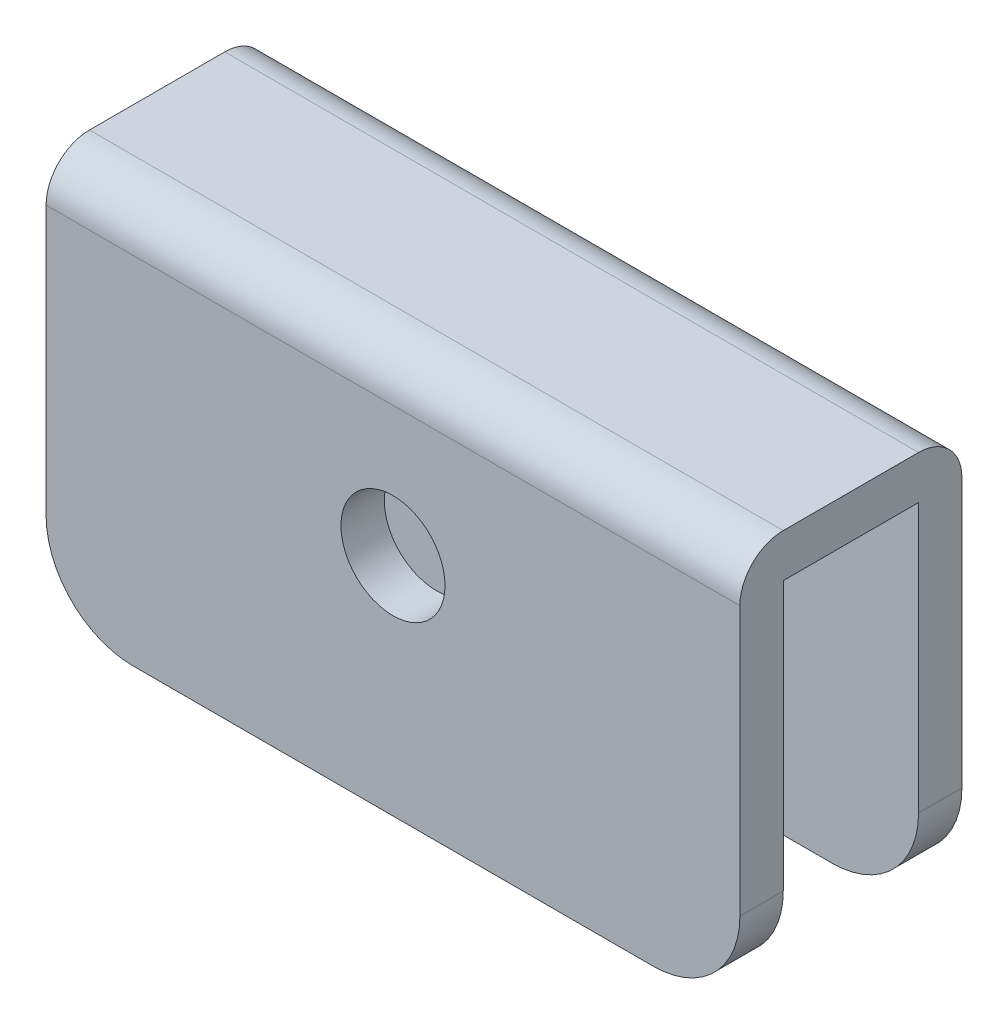
ISO-10303-21;
HEADER;
FILE_DESCRIPTION(('STEP AP214'),'2;1');
FILE_NAME('part.step','',(''),(''),'','','');
FILE_SCHEMA(('AUTOMOTIVE_DESIGN { 1 0 10303 214 1 1 1 1 }'));
ENDSEC;
DATA;
#1=APPLICATION_CONTEXT('core data for automotive mechanical design processes');
#2=APPLICATION_PROTOCOL_DEFINITION('international standard','automotive_design',2000,#1);
#3=PRODUCT_CONTEXT('',#1,'mechanical');
#4=PRODUCT('Part','Part','',(#3));
#5=PRODUCT_RELATED_PRODUCT_CATEGORY('part','',(#4));
#6=PRODUCT_DEFINITION_FORMATION('','',#4);
#7=PRODUCT_DEFINITION_CONTEXT('part definition',#1,'design');
#8=PRODUCT_DEFINITION('design','',#6,#7);
#9=PRODUCT_DEFINITION_SHAPE('','',#8);
#10=(LENGTH_UNIT() NAMED_UNIT(*) SI_UNIT(.MILLI.,.METRE.));
#11=(NAMED_UNIT(*) PLANE_ANGLE_UNIT() SI_UNIT($,.RADIAN.));
#12=(NAMED_UNIT(*) SI_UNIT($,.STERADIAN.) SOLID_ANGLE_UNIT());
#13=UNCERTAINTY_MEASURE_WITH_UNIT(LENGTH_MEASURE(1.E-05),#10,'distance_accuracy_value','');
#14=(GEOMETRIC_REPRESENTATION_CONTEXT(3) GLOBAL_UNCERTAINTY_ASSIGNED_CONTEXT((#13)) GLOBAL_UNIT_ASSIGNED_CONTEXT((#10,
#11,#12)) REPRESENTATION_CONTEXT('',''));
#15=CARTESIAN_POINT('',(0.,0.,0.));
#16=DIRECTION('',(0.,0.,1.));
#17=DIRECTION('',(1.,0.,0.));
#18=AXIS2_PLACEMENT_3D('',#15,#16,#17);
#19=CARTESIAN_POINT('',(-20.,-11.5,-6.4));
#20=DIRECTION('',(0.,-1.,0.));
#21=DIRECTION('',(0.,0.,-1.));
#22=AXIS2_PLACEMENT_3D('',#19,#20,#21);
#23=PLANE('',#22);
#24=DIRECTION('',(1.,0.,0.));
#25=VECTOR('',#24,1.);
#26=CARTESIAN_POINT('',(-41.9337639268777,-11.5,-3.9));
#27=LINE('',#26,#25);
#28=CARTESIAN_POINT('',(-15.,-11.5,-3.9));
#29=VERTEX_POINT('',#28);
#30=CARTESIAN_POINT('',(15.,-11.5,-3.9));
#31=VERTEX_POINT('',#30);
#32=EDGE_CURVE('E155',#29,#31,#27,.T.);
#33=ORIENTED_EDGE('',*,*,#32,.F.);
#34=DIRECTION('',(0.,0.,1.));
#35=VECTOR('',#34,1.);
#36=CARTESIAN_POINT('',(-15.,-11.5,-6.4));
#37=LINE('',#36,#35);
#38=CARTESIAN_POINT('',(-15.,-11.5,-6.4));
#39=VERTEX_POINT('',#38);
#40=EDGE_CURVE('E219',#29,#39,#37,.F.);
#41=ORIENTED_EDGE('',*,*,#40,.T.);
#42=DIRECTION('',(1.,0.,0.));
#43=VECTOR('',#42,1.);
#44=CARTESIAN_POINT('',(-20.,-11.5,-6.4));
#45=LINE('',#44,#43);
#46=CARTESIAN_POINT('',(15.,-11.5,-6.4));
#47=VERTEX_POINT('',#46);
#48=EDGE_CURVE('E199',#39,#47,#45,.T.);
#49=ORIENTED_EDGE('',*,*,#48,.T.);
#50=DIRECTION('',(0.,0.,1.));
#51=VECTOR('',#50,1.);
#52=CARTESIAN_POINT('',(15.,-11.5,-6.4));
#53=LINE('',#52,#51);
#54=EDGE_CURVE('E216',#47,#31,#53,.T.);
#55=ORIENTED_EDGE('',*,*,#54,.T.);
#56=EDGE_LOOP('',(#33,#41,#49,#55));
#57=FACE_BOUND('',#56,.T.);
#58=ADVANCED_FACE('F40',(#57),#23,.T.);
#59=CARTESIAN_POINT('',(20.,11.5,-6.4));
#60=DIRECTION('',(1.,0.,0.));
#61=DIRECTION('',(0.,1.,0.));
#62=AXIS2_PLACEMENT_3D('',#59,#60,#61);
#63=PLANE('',#62);
#64=DIRECTION('',(0.,1.,0.));
#65=VECTOR('',#64,1.);
#66=CARTESIAN_POINT('',(20.,11.5,-6.4));
#67=LINE('',#66,#65);
#68=CARTESIAN_POINT('',(20.,-6.5,-6.4));
#69=VERTEX_POINT('',#68);
#70=CARTESIAN_POINT('',(20.,9.,-6.4));
#71=VERTEX_POINT('',#70);
#72=EDGE_CURVE('E195',#69,#71,#67,.T.);
#73=ORIENTED_EDGE('',*,*,#72,.T.);
#74=CARTESIAN_POINT('',(20.,9.,-3.9));
#75=DIRECTION('',(1.,0.,0.));
#76=DIRECTION('',(0.,1.,0.));
#77=AXIS2_PLACEMENT_3D('',#74,#75,#76);
#78=CIRCLE('',#77,2.5);
#79=CARTESIAN_POINT('',(20.,11.5,-3.9));
#80=VERTEX_POINT('',#79);
#81=EDGE_CURVE('E49',#71,#80,#78,.T.);
#82=ORIENTED_EDGE('',*,*,#81,.T.);
#83=DIRECTION('',(0.,0.,1.));
#84=VECTOR('',#83,1.);
#85=CARTESIAN_POINT('',(20.,11.5,-6.4));
#86=LINE('',#85,#84);
#87=CARTESIAN_POINT('',(20.,11.5,3.9));
#88=VERTEX_POINT('',#87);
#89=EDGE_CURVE('E202',#80,#88,#86,.T.);
#90=ORIENTED_EDGE('',*,*,#89,.T.);
#91=CARTESIAN_POINT('',(20.,9.,3.9));
#92=DIRECTION('',(1.,0.,0.));
#93=DIRECTION('',(0.,1.,0.));
#94=AXIS2_PLACEMENT_3D('',#91,#92,#93);
#95=CIRCLE('',#94,2.5);
#96=CARTESIAN_POINT('',(20.,9.,6.4));
#97=VERTEX_POINT('',#96);
#98=EDGE_CURVE('E56',#88,#97,#95,.T.);
#99=ORIENTED_EDGE('',*,*,#98,.T.);
#100=DIRECTION('',(0.,1.,0.));
#101=VECTOR('',#100,1.);
#102=CARTESIAN_POINT('',(20.,11.5,6.4));
#103=LINE('',#102,#101);
#104=CARTESIAN_POINT('',(20.,-6.5,6.4));
#105=VERTEX_POINT('',#104);
#106=EDGE_CURVE('E188',#105,#97,#103,.T.);
#107=ORIENTED_EDGE('',*,*,#106,.F.);
#108=DIRECTION('',(0.,0.,1.));
#109=VECTOR('',#108,1.);
#110=CARTESIAN_POINT('',(20.,-6.5,-6.4));
#111=LINE('',#110,#109);
#112=CARTESIAN_POINT('',(20.,-6.5,3.9));
#113=VERTEX_POINT('',#112);
#114=EDGE_CURVE('E239',#105,#113,#111,.F.);
#115=ORIENTED_EDGE('',*,*,#114,.T.);
#116=DIRECTION('',(0.,-1.,0.));
#117=VECTOR('',#116,1.);
#118=CARTESIAN_POINT('',(20.,-11.5,3.9));
#119=LINE('',#118,#117);
#120=CARTESIAN_POINT('',(20.,9.,3.9));
#121=VERTEX_POINT('',#120);
#122=EDGE_CURVE('E156',#121,#113,#119,.T.);
#123=ORIENTED_EDGE('',*,*,#122,.F.);
#124=DIRECTION('',(0.,0.,1.));
#125=VECTOR('',#124,1.);
#126=CARTESIAN_POINT('',(20.,9.,3.9));
#127=LINE('',#126,#125);
#128=CARTESIAN_POINT('',(20.,9.,-3.9));
#129=VERTEX_POINT('',#128);
#130=EDGE_CURVE('E163',#129,#121,#127,.T.);
#131=ORIENTED_EDGE('',*,*,#130,.F.);
#132=DIRECTION('',(0.,1.,0.));
#133=VECTOR('',#132,1.);
#134=CARTESIAN_POINT('',(20.,-11.5,-3.9));
#135=LINE('',#134,#133);
#136=CARTESIAN_POINT('',(20.,-6.5,-3.9));
#137=VERTEX_POINT('',#136);
#138=EDGE_CURVE('E146',#137,#129,#135,.T.);
#139=ORIENTED_EDGE('',*,*,#138,.F.);
#140=DIRECTION('',(0.,0.,1.));
#141=VECTOR('',#140,1.);
#142=CARTESIAN_POINT('',(20.,-6.5,-6.4));
#143=LINE('',#142,#141);
#144=EDGE_CURVE('E241',#137,#69,#143,.F.);
#145=ORIENTED_EDGE('',*,*,#144,.T.);
#146=EDGE_LOOP('',(#73,#82,#90,#99,#107,#115,#123,#131,#139,#145));
#147=FACE_BOUND('',#146,.T.);
#148=ADVANCED_FACE('F169',(#147),#63,.T.);
#149=DIRECTION('',(1.,0.,0.));
#150=VECTOR('',#149,1.);
#151=CARTESIAN_POINT('',(-20.,-11.5,6.4));
#152=LINE('',#151,#150);
#153=CARTESIAN_POINT('',(-15.,-11.5,6.4));
#154=VERTEX_POINT('',#153);
#155=CARTESIAN_POINT('',(15.,-11.5,6.4));
#156=VERTEX_POINT('',#155);
#157=EDGE_CURVE('E192',#154,#156,#152,.T.);
#158=ORIENTED_EDGE('',*,*,#157,.F.);
#159=DIRECTION('',(0.,0.,1.));
#160=VECTOR('',#159,1.);
#161=CARTESIAN_POINT('',(-15.,-11.5,-6.4));
#162=LINE('',#161,#160);
#163=CARTESIAN_POINT('',(-15.,-11.5,3.9));
#164=VERTEX_POINT('',#163);
#165=EDGE_CURVE('E233',#154,#164,#162,.F.);
#166=ORIENTED_EDGE('',*,*,#165,.T.);
#167=DIRECTION('',(1.,0.,0.));
#168=VECTOR('',#167,1.);
#169=CARTESIAN_POINT('',(-41.9337639268777,-11.5,3.9));
#170=LINE('',#169,#168);
#171=CARTESIAN_POINT('',(15.,-11.5,3.9));
#172=VERTEX_POINT('',#171);
#173=EDGE_CURVE('E180',#164,#172,#170,.T.);
#174=ORIENTED_EDGE('',*,*,#173,.T.);
#175=DIRECTION('',(0.,0.,1.));
#176=VECTOR('',#175,1.);
#177=CARTESIAN_POINT('',(15.,-11.5,-6.4));
#178=LINE('',#177,#176);
#179=EDGE_CURVE('E230',#172,#156,#178,.T.);
#180=ORIENTED_EDGE('',*,*,#179,.T.);
#181=EDGE_LOOP('',(#158,#166,#174,#180));
#182=FACE_BOUND('',#181,.T.);
#183=ADVANCED_FACE('F292',(#182),#23,.T.);
#184=CARTESIAN_POINT('',(-20.,11.5,-6.4));
#185=DIRECTION('',(-1.,0.,0.));
#186=DIRECTION('',(0.,-1.,0.));
#187=AXIS2_PLACEMENT_3D('',#184,#185,#186);
#188=PLANE('',#187);
#189=DIRECTION('',(0.,0.,1.));
#190=VECTOR('',#189,1.);
#191=CARTESIAN_POINT('',(-20.,11.5,-6.4));
#192=LINE('',#191,#190);
#193=CARTESIAN_POINT('',(-20.,11.5,-3.9));
#194=VERTEX_POINT('',#193);
#195=CARTESIAN_POINT('',(-20.,11.5,3.9));
#196=VERTEX_POINT('',#195);
#197=EDGE_CURVE('E203',#194,#196,#192,.T.);
#198=ORIENTED_EDGE('',*,*,#197,.F.);
#199=CARTESIAN_POINT('',(-20.,9.,-3.9));
#200=DIRECTION('',(-1.,0.,0.));
#201=DIRECTION('',(0.,-1.,0.));
#202=AXIS2_PLACEMENT_3D('',#199,#200,#201);
#203=CIRCLE('',#202,2.5);
#204=CARTESIAN_POINT('',(-20.,9.,-6.4));
#205=VERTEX_POINT('',#204);
#206=EDGE_CURVE('E250',#194,#205,#203,.T.);
#207=ORIENTED_EDGE('',*,*,#206,.T.);
#208=DIRECTION('',(0.,-1.,0.));
#209=VECTOR('',#208,1.);
#210=CARTESIAN_POINT('',(-20.,11.5,-6.4));
#211=LINE('',#210,#209);
#212=CARTESIAN_POINT('',(-20.,-6.5,-6.4));
#213=VERTEX_POINT('',#212);
#214=EDGE_CURVE('E197',#205,#213,#211,.T.);
#215=ORIENTED_EDGE('',*,*,#214,.T.);
#216=DIRECTION('',(0.,0.,1.));
#217=VECTOR('',#216,1.);
#218=CARTESIAN_POINT('',(-20.,-6.5,-6.4));
#219=LINE('',#218,#217);
#220=CARTESIAN_POINT('',(-20.,-6.5,-3.9));
#221=VERTEX_POINT('',#220);
#222=EDGE_CURVE('E210',#213,#221,#219,.T.);
#223=ORIENTED_EDGE('',*,*,#222,.T.);
#224=DIRECTION('',(0.,1.,0.));
#225=VECTOR('',#224,1.);
#226=CARTESIAN_POINT('',(-20.,-11.5,-3.9));
#227=LINE('',#226,#225);
#228=CARTESIAN_POINT('',(-20.,9.,-3.9));
#229=VERTEX_POINT('',#228);
#230=EDGE_CURVE('E167',#221,#229,#227,.T.);
#231=ORIENTED_EDGE('',*,*,#230,.T.);
#232=DIRECTION('',(0.,0.,1.));
#233=VECTOR('',#232,1.);
#234=CARTESIAN_POINT('',(-20.,9.,3.9));
#235=LINE('',#234,#233);
#236=CARTESIAN_POINT('',(-20.,9.,3.9));
#237=VERTEX_POINT('',#236);
#238=EDGE_CURVE('E166',#229,#237,#235,.T.);
#239=ORIENTED_EDGE('',*,*,#238,.T.);
#240=DIRECTION('',(0.,-1.,0.));
#241=VECTOR('',#240,1.);
#242=CARTESIAN_POINT('',(-20.,-11.5,3.9));
#243=LINE('',#242,#241);
#244=CARTESIAN_POINT('',(-20.,-6.5,3.9));
#245=VERTEX_POINT('',#244);
#246=EDGE_CURVE('E177',#237,#245,#243,.T.);
#247=ORIENTED_EDGE('',*,*,#246,.T.);
#248=DIRECTION('',(0.,0.,1.));
#249=VECTOR('',#248,1.);
#250=CARTESIAN_POINT('',(-20.,-6.5,-6.4));
#251=LINE('',#250,#249);
#252=CARTESIAN_POINT('',(-20.,-6.5,6.4));
#253=VERTEX_POINT('',#252);
#254=EDGE_CURVE('E206',#245,#253,#251,.T.);
#255=ORIENTED_EDGE('',*,*,#254,.T.);
#256=DIRECTION('',(0.,-1.,0.));
#257=VECTOR('',#256,1.);
#258=CARTESIAN_POINT('',(-20.,11.5,6.4));
#259=LINE('',#258,#257);
#260=CARTESIAN_POINT('',(-20.,9.,6.4));
#261=VERTEX_POINT('',#260);
#262=EDGE_CURVE('E190',#261,#253,#259,.T.);
#263=ORIENTED_EDGE('',*,*,#262,.F.);
#264=CARTESIAN_POINT('',(-20.,9.,3.9));
#265=DIRECTION('',(-1.,0.,0.));
#266=DIRECTION('',(0.,-1.,0.));
#267=AXIS2_PLACEMENT_3D('',#264,#265,#266);
#268=CIRCLE('',#267,2.5);
#269=EDGE_CURVE('E248',#261,#196,#268,.T.);
#270=ORIENTED_EDGE('',*,*,#269,.T.);
#271=EDGE_LOOP('',(#198,#207,#215,#223,#231,#239,#247,#255,#263,#270));
#272=FACE_BOUND('',#271,.T.);
#273=ADVANCED_FACE('F264',(#272),#188,.T.);
#274=CARTESIAN_POINT('',(-20.,11.5,-6.4));
#275=DIRECTION('',(0.,1.,0.));
#276=DIRECTION('',(0.,0.,1.));
#277=AXIS2_PLACEMENT_3D('',#274,#275,#276);
#278=PLANE('',#277);
#279=ORIENTED_EDGE('',*,*,#89,.F.);
#280=DIRECTION('',(-1.,0.,0.));
#281=VECTOR('',#280,1.);
#282=CARTESIAN_POINT('',(-20.,11.5,-3.9));
#283=LINE('',#282,#281);
#284=EDGE_CURVE('E245',#80,#194,#283,.T.);
#285=ORIENTED_EDGE('',*,*,#284,.T.);
#286=ORIENTED_EDGE('',*,*,#197,.T.);
#287=DIRECTION('',(-1.,0.,0.));
#288=VECTOR('',#287,1.);
#289=CARTESIAN_POINT('',(-20.,11.5,3.9));
#290=LINE('',#289,#288);
#291=EDGE_CURVE('E243',#196,#88,#290,.F.);
#292=ORIENTED_EDGE('',*,*,#291,.T.);
#293=EDGE_LOOP('',(#279,#285,#286,#292));
#294=FACE_BOUND('',#293,.T.);
#295=ADVANCED_FACE('F259',(#294),#278,.T.);
#296=CARTESIAN_POINT('',(0.,0.,-6.4));
#297=DIRECTION('',(0.,0.,1.));
#298=DIRECTION('',(1.,0.,0.));
#299=AXIS2_PLACEMENT_3D('',#296,#297,#298);
#300=PLANE('',#299);
#301=CARTESIAN_POINT('',(0.,1.5,-6.4));
#302=DIRECTION('',(0.,0.,1.));
#303=DIRECTION('',(1.,0.,0.));
#304=AXIS2_PLACEMENT_3D('',#301,#302,#303);
#305=CIRCLE('',#304,3.);
#306=CARTESIAN_POINT('',(3.,1.5,-6.4));
#307=VERTEX_POINT('',#306);
#308=EDGE_CURVE('E462',#307,#307,#305,.F.);
#309=ORIENTED_EDGE('',*,*,#308,.F.);
#310=EDGE_LOOP('',(#309));
#311=FACE_BOUND('',#310,.T.);
#312=ORIENTED_EDGE('',*,*,#214,.F.);
#313=DIRECTION('',(-1.,0.,0.));
#314=VECTOR('',#313,1.);
#315=CARTESIAN_POINT('',(20.,9.,-6.4));
#316=LINE('',#315,#314);
#317=EDGE_CURVE('E64',#205,#71,#316,.F.);
#318=ORIENTED_EDGE('',*,*,#317,.T.);
#319=ORIENTED_EDGE('',*,*,#72,.F.);
#320=CARTESIAN_POINT('',(15.,-6.5,-6.4));
#321=DIRECTION('',(0.,0.,1.));
#322=DIRECTION('',(1.,0.,0.));
#323=AXIS2_PLACEMENT_3D('',#320,#321,#322);
#324=CIRCLE('',#323,5.);
#325=EDGE_CURVE('E221',#69,#47,#324,.F.);
#326=ORIENTED_EDGE('',*,*,#325,.T.);
#327=ORIENTED_EDGE('',*,*,#48,.F.);
#328=CARTESIAN_POINT('',(-15.,-6.5,-6.4));
#329=DIRECTION('',(0.,0.,1.));
#330=DIRECTION('',(1.,0.,0.));
#331=AXIS2_PLACEMENT_3D('',#328,#329,#330);
#332=CIRCLE('',#331,5.);
#333=EDGE_CURVE('E223',#39,#213,#332,.F.);
#334=ORIENTED_EDGE('',*,*,#333,.T.);
#335=EDGE_LOOP('',(#312,#318,#319,#326,#327,#334));
#336=FACE_BOUND('',#335,.T.);
#337=ADVANCED_FACE('F265',(#311,#336),#300,.F.);
#338=CARTESIAN_POINT('',(0.,0.,6.4));
#339=DIRECTION('',(0.,0.,1.));
#340=DIRECTION('',(1.,0.,0.));
#341=AXIS2_PLACEMENT_3D('',#338,#339,#340);
#342=PLANE('',#341);
#343=CARTESIAN_POINT('',(0.,1.5,6.4));
#344=DIRECTION('',(0.,0.,1.));
#345=DIRECTION('',(1.,0.,0.));
#346=AXIS2_PLACEMENT_3D('',#343,#344,#345);
#347=CIRCLE('',#346,3.);
#348=CARTESIAN_POINT('',(3.,1.5,6.4));
#349=VERTEX_POINT('',#348);
#350=EDGE_CURVE('E464',#349,#349,#347,.T.);
#351=ORIENTED_EDGE('',*,*,#350,.F.);
#352=EDGE_LOOP('',(#351));
#353=FACE_BOUND('',#352,.T.);
#354=ORIENTED_EDGE('',*,*,#106,.T.);
#355=DIRECTION('',(-1.,0.,0.));
#356=VECTOR('',#355,1.);
#357=CARTESIAN_POINT('',(0.,9.,6.4));
#358=LINE('',#357,#356);
#359=EDGE_CURVE('E11',#97,#261,#358,.T.);
#360=ORIENTED_EDGE('',*,*,#359,.T.);
#361=ORIENTED_EDGE('',*,*,#262,.T.);
#362=CARTESIAN_POINT('',(-15.,-6.5,6.4));
#363=DIRECTION('',(0.,0.,1.));
#364=DIRECTION('',(1.,0.,0.));
#365=AXIS2_PLACEMENT_3D('',#362,#363,#364);
#366=CIRCLE('',#365,5.);
#367=EDGE_CURVE('E228',#253,#154,#366,.T.);
#368=ORIENTED_EDGE('',*,*,#367,.T.);
#369=ORIENTED_EDGE('',*,*,#157,.T.);
#370=CARTESIAN_POINT('',(15.,-6.5,6.4));
#371=DIRECTION('',(0.,0.,1.));
#372=DIRECTION('',(1.,0.,0.));
#373=AXIS2_PLACEMENT_3D('',#370,#371,#372);
#374=CIRCLE('',#373,5.);
#375=EDGE_CURVE('E226',#156,#105,#374,.T.);
#376=ORIENTED_EDGE('',*,*,#375,.T.);
#377=EDGE_LOOP('',(#354,#360,#361,#368,#369,#376));
#378=FACE_BOUND('',#377,.T.);
#379=ADVANCED_FACE('F315',(#353,#378),#342,.T.);
#380=CARTESIAN_POINT('',(-41.9337639268777,-11.5,-3.9));
#381=DIRECTION('',(0.,0.,-1.));
#382=DIRECTION('',(0.,1.,0.));
#383=AXIS2_PLACEMENT_3D('',#380,#381,#382);
#384=PLANE('',#383);
#385=CARTESIAN_POINT('',(0.,1.5,-3.9));
#386=DIRECTION('',(0.,0.,-1.));
#387=DIRECTION('',(0.,1.,0.));
#388=AXIS2_PLACEMENT_3D('',#385,#386,#387);
#389=CIRCLE('',#388,3.);
#390=CARTESIAN_POINT('',(0.,4.5,-3.9));
#391=VERTEX_POINT('',#390);
#392=EDGE_CURVE('E171',#391,#391,#389,.T.);
#393=ORIENTED_EDGE('',*,*,#392,.T.);
#394=EDGE_LOOP('',(#393));
#395=FACE_BOUND('',#394,.T.);
#396=ORIENTED_EDGE('',*,*,#230,.F.);
#397=CARTESIAN_POINT('',(-15.,-6.5,-3.9));
#398=DIRECTION('',(0.,0.,-1.));
#399=DIRECTION('',(0.,1.,0.));
#400=AXIS2_PLACEMENT_3D('',#397,#398,#399);
#401=CIRCLE('',#400,5.);
#402=EDGE_CURVE('E214',#221,#29,#401,.F.);
#403=ORIENTED_EDGE('',*,*,#402,.T.);
#404=ORIENTED_EDGE('',*,*,#32,.T.);
#405=CARTESIAN_POINT('',(15.,-6.5,-3.9));
#406=DIRECTION('',(0.,0.,-1.));
#407=DIRECTION('',(0.,1.,0.));
#408=AXIS2_PLACEMENT_3D('',#405,#406,#407);
#409=CIRCLE('',#408,5.);
#410=EDGE_CURVE('E152',#31,#137,#409,.F.);
#411=ORIENTED_EDGE('',*,*,#410,.T.);
#412=ORIENTED_EDGE('',*,*,#138,.T.);
#413=DIRECTION('',(1.,0.,0.));
#414=VECTOR('',#413,1.);
#415=CARTESIAN_POINT('',(-41.9337639268777,9.,-3.9));
#416=LINE('',#415,#414);
#417=EDGE_CURVE('E150',#229,#129,#416,.T.);
#418=ORIENTED_EDGE('',*,*,#417,.F.);
#419=EDGE_LOOP('',(#396,#403,#404,#411,#412,#418));
#420=FACE_BOUND('',#419,.T.);
#421=ADVANCED_FACE('F149',(#395,#420),#384,.F.);
#422=CARTESIAN_POINT('',(-41.9337639268777,9.,3.9));
#423=DIRECTION('',(0.,1.,0.));
#424=DIRECTION('',(0.,0.,1.));
#425=AXIS2_PLACEMENT_3D('',#422,#423,#424);
#426=PLANE('',#425);
#427=ORIENTED_EDGE('',*,*,#417,.T.);
#428=ORIENTED_EDGE('',*,*,#130,.T.);
#429=DIRECTION('',(1.,0.,0.));
#430=VECTOR('',#429,1.);
#431=CARTESIAN_POINT('',(-41.9337639268777,9.,3.9));
#432=LINE('',#431,#430);
#433=EDGE_CURVE('E181',#237,#121,#432,.T.);
#434=ORIENTED_EDGE('',*,*,#433,.F.);
#435=ORIENTED_EDGE('',*,*,#238,.F.);
#436=EDGE_LOOP('',(#427,#428,#434,#435));
#437=FACE_BOUND('',#436,.T.);
#438=ADVANCED_FACE('F161',(#437),#426,.F.);
#439=CARTESIAN_POINT('',(-41.9337639268777,-11.5,3.9));
#440=DIRECTION('',(0.,0.,1.));
#441=DIRECTION('',(0.,-1.,0.));
#442=AXIS2_PLACEMENT_3D('',#439,#440,#441);
#443=PLANE('',#442);
#444=CARTESIAN_POINT('',(0.,1.5,3.9));
#445=DIRECTION('',(0.,0.,1.));
#446=DIRECTION('',(0.,-1.,0.));
#447=AXIS2_PLACEMENT_3D('',#444,#445,#446);
#448=CIRCLE('',#447,3.);
#449=CARTESIAN_POINT('',(0.,-1.5,3.9));
#450=VERTEX_POINT('',#449);
#451=EDGE_CURVE('E44',#450,#450,#448,.T.);
#452=ORIENTED_EDGE('',*,*,#451,.T.);
#453=EDGE_LOOP('',(#452));
#454=FACE_BOUND('',#453,.T.);
#455=ORIENTED_EDGE('',*,*,#173,.F.);
#456=CARTESIAN_POINT('',(-15.,-6.5,3.9));
#457=DIRECTION('',(0.,0.,1.));
#458=DIRECTION('',(0.,-1.,0.));
#459=AXIS2_PLACEMENT_3D('',#456,#457,#458);
#460=CIRCLE('',#459,5.);
#461=EDGE_CURVE('E237',#164,#245,#460,.F.);
#462=ORIENTED_EDGE('',*,*,#461,.T.);
#463=ORIENTED_EDGE('',*,*,#246,.F.);
#464=ORIENTED_EDGE('',*,*,#433,.T.);
#465=ORIENTED_EDGE('',*,*,#122,.T.);
#466=CARTESIAN_POINT('',(15.,-6.5,3.9));
#467=DIRECTION('',(0.,0.,1.));
#468=DIRECTION('',(0.,-1.,0.));
#469=AXIS2_PLACEMENT_3D('',#466,#467,#468);
#470=CIRCLE('',#469,5.);
#471=EDGE_CURVE('E235',#113,#172,#470,.F.);
#472=ORIENTED_EDGE('',*,*,#471,.T.);
#473=EDGE_LOOP('',(#455,#462,#463,#464,#465,#472));
#474=FACE_BOUND('',#473,.T.);
#475=ADVANCED_FACE('F313',(#454,#474),#443,.F.);
#476=CARTESIAN_POINT('',(-15.,-6.5,-6.4));
#477=DIRECTION('',(0.,0.,1.));
#478=DIRECTION('',(1.,0.,0.));
#479=AXIS2_PLACEMENT_3D('',#476,#477,#478);
#480=CYLINDRICAL_SURFACE('',#479,5.);
#481=ORIENTED_EDGE('',*,*,#333,.F.);
#482=ORIENTED_EDGE('',*,*,#40,.F.);
#483=ORIENTED_EDGE('',*,*,#402,.F.);
#484=ORIENTED_EDGE('',*,*,#222,.F.);
#485=EDGE_LOOP('',(#481,#482,#483,#484));
#486=FACE_BOUND('',#485,.T.);
#487=ADVANCED_FACE('F271',(#486),#480,.T.);
#488=CARTESIAN_POINT('',(-15.,-6.5,-6.4));
#489=DIRECTION('',(0.,0.,1.));
#490=DIRECTION('',(1.,0.,0.));
#491=AXIS2_PLACEMENT_3D('',#488,#489,#490);
#492=CYLINDRICAL_SURFACE('',#491,5.);
#493=ORIENTED_EDGE('',*,*,#461,.F.);
#494=ORIENTED_EDGE('',*,*,#165,.F.);
#495=ORIENTED_EDGE('',*,*,#367,.F.);
#496=ORIENTED_EDGE('',*,*,#254,.F.);
#497=EDGE_LOOP('',(#493,#494,#495,#496));
#498=FACE_BOUND('',#497,.T.);
#499=ADVANCED_FACE('F280',(#498),#492,.T.);
#500=CARTESIAN_POINT('',(15.,-6.5,-6.4));
#501=DIRECTION('',(0.,0.,1.));
#502=DIRECTION('',(1.,0.,0.));
#503=AXIS2_PLACEMENT_3D('',#500,#501,#502);
#504=CYLINDRICAL_SURFACE('',#503,5.);
#505=ORIENTED_EDGE('',*,*,#325,.F.);
#506=ORIENTED_EDGE('',*,*,#144,.F.);
#507=ORIENTED_EDGE('',*,*,#410,.F.);
#508=ORIENTED_EDGE('',*,*,#54,.F.);
#509=EDGE_LOOP('',(#505,#506,#507,#508));
#510=FACE_BOUND('',#509,.T.);
#511=ADVANCED_FACE('F277',(#510),#504,.T.);
#512=CARTESIAN_POINT('',(15.,-6.5,-6.4));
#513=DIRECTION('',(0.,0.,1.));
#514=DIRECTION('',(1.,0.,0.));
#515=AXIS2_PLACEMENT_3D('',#512,#513,#514);
#516=CYLINDRICAL_SURFACE('',#515,5.);
#517=ORIENTED_EDGE('',*,*,#471,.F.);
#518=ORIENTED_EDGE('',*,*,#114,.F.);
#519=ORIENTED_EDGE('',*,*,#375,.F.);
#520=ORIENTED_EDGE('',*,*,#179,.F.);
#521=EDGE_LOOP('',(#517,#518,#519,#520));
#522=FACE_BOUND('',#521,.T.);
#523=ADVANCED_FACE('F279',(#522),#516,.T.);
#524=CARTESIAN_POINT('',(-20.,9.,-3.9));
#525=DIRECTION('',(1.,0.,0.));
#526=DIRECTION('',(0.,0.,-1.));
#527=AXIS2_PLACEMENT_3D('',#524,#525,#526);
#528=CYLINDRICAL_SURFACE('',#527,2.5);
#529=ORIENTED_EDGE('',*,*,#81,.F.);
#530=ORIENTED_EDGE('',*,*,#317,.F.);
#531=ORIENTED_EDGE('',*,*,#206,.F.);
#532=ORIENTED_EDGE('',*,*,#284,.F.);
#533=EDGE_LOOP('',(#529,#530,#531,#532));
#534=FACE_BOUND('',#533,.T.);
#535=ADVANCED_FACE('F262',(#534),#528,.T.);
#536=CARTESIAN_POINT('',(0.,9.,3.9));
#537=DIRECTION('',(-1.,0.,0.));
#538=DIRECTION('',(0.,0.,1.));
#539=AXIS2_PLACEMENT_3D('',#536,#537,#538);
#540=CYLINDRICAL_SURFACE('',#539,2.5);
#541=ORIENTED_EDGE('',*,*,#98,.F.);
#542=ORIENTED_EDGE('',*,*,#291,.F.);
#543=ORIENTED_EDGE('',*,*,#269,.F.);
#544=ORIENTED_EDGE('',*,*,#359,.F.);
#545=EDGE_LOOP('',(#541,#542,#543,#544));
#546=FACE_BOUND('',#545,.T.);
#547=ADVANCED_FACE('F42',(#546),#540,.T.);
#548=CARTESIAN_POINT('',(0.,1.5,-14.8852813742386));
#549=DIRECTION('',(0.,0.,1.));
#550=DIRECTION('',(1.,0.,0.));
#551=AXIS2_PLACEMENT_3D('',#548,#549,#550);
#552=CYLINDRICAL_SURFACE('',#551,3.);
#553=ORIENTED_EDGE('',*,*,#350,.T.);
#554=EDGE_LOOP('',(#553));
#555=FACE_BOUND('',#554,.T.);
#556=ORIENTED_EDGE('',*,*,#451,.F.);
#557=EDGE_LOOP('',(#556));
#558=FACE_BOUND('',#557,.T.);
#559=ADVANCED_FACE('F319',(#555,#558),#552,.F.);
#560=ORIENTED_EDGE('',*,*,#308,.T.);
#561=EDGE_LOOP('',(#560));
#562=FACE_BOUND('',#561,.T.);
#563=ORIENTED_EDGE('',*,*,#392,.F.);
#564=EDGE_LOOP('',(#563));
#565=FACE_BOUND('',#564,.T.);
#566=ADVANCED_FACE('F324',(#562,#565),#552,.F.);
#567=CLOSED_SHELL('',(#58,#148,#183,#273,#295,#337,#379,#421,#438,#475,#487,#499,#511,#523,#535,
#547,#559,#566));
#568=MANIFOLD_SOLID_BREP('B2',#567);
#569=ADVANCED_BREP_SHAPE_REPRESENTATION('',(#18,#568),#14);
#570=SHAPE_DEFINITION_REPRESENTATION(#9,#569);
ENDSEC;
END-ISO-10303-21;
